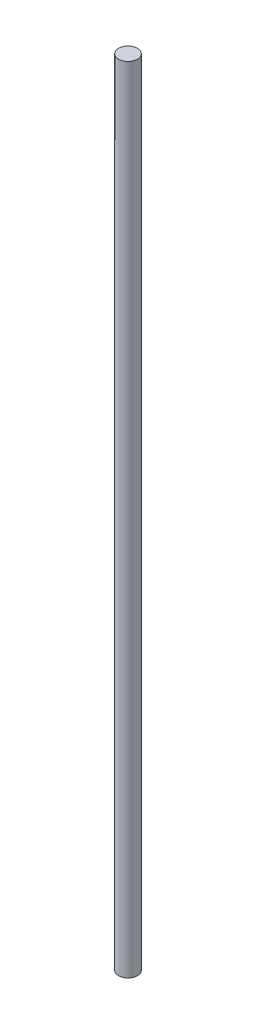
ISO-10303-21;
HEADER;
FILE_DESCRIPTION(('STEP AP214'),'2;1');
FILE_NAME('part.step','',(''),(''),'','','');
FILE_SCHEMA(('AUTOMOTIVE_DESIGN { 1 0 10303 214 1 1 1 1 }'));
ENDSEC;
DATA;
#1=APPLICATION_CONTEXT('core data for automotive mechanical design processes');
#2=APPLICATION_PROTOCOL_DEFINITION('international standard','automotive_design',2000,#1);
#3=PRODUCT_CONTEXT('',#1,'mechanical');
#4=PRODUCT('Part','Part','',(#3));
#5=PRODUCT_RELATED_PRODUCT_CATEGORY('part','',(#4));
#6=PRODUCT_DEFINITION_FORMATION('','',#4);
#7=PRODUCT_DEFINITION_CONTEXT('part definition',#1,'design');
#8=PRODUCT_DEFINITION('design','',#6,#7);
#9=PRODUCT_DEFINITION_SHAPE('','',#8);
#10=(LENGTH_UNIT() NAMED_UNIT(*) SI_UNIT(.MILLI.,.METRE.));
#11=(NAMED_UNIT(*) PLANE_ANGLE_UNIT() SI_UNIT($,.RADIAN.));
#12=(NAMED_UNIT(*) SI_UNIT($,.STERADIAN.) SOLID_ANGLE_UNIT());
#13=UNCERTAINTY_MEASURE_WITH_UNIT(LENGTH_MEASURE(1.E-05),#10,'distance_accuracy_value','');
#14=(GEOMETRIC_REPRESENTATION_CONTEXT(3) GLOBAL_UNCERTAINTY_ASSIGNED_CONTEXT((#13)) GLOBAL_UNIT_ASSIGNED_CONTEXT((#10,
#11,#12)) REPRESENTATION_CONTEXT('',''));
#15=CARTESIAN_POINT('',(0.,0.,0.));
#16=DIRECTION('',(0.,0.,1.));
#17=DIRECTION('',(1.,0.,0.));
#18=AXIS2_PLACEMENT_3D('',#15,#16,#17);
#19=CARTESIAN_POINT('',(0.,210.,0.));
#20=DIRECTION('',(0.,-1.,0.));
#21=DIRECTION('',(0.,0.,-1.));
#22=AXIS2_PLACEMENT_3D('',#19,#20,#21);
#23=CYLINDRICAL_SURFACE('',#22,2.5);
#24=CARTESIAN_POINT('',(0.,210.,0.));
#25=DIRECTION('',(0.,1.,0.));
#26=DIRECTION('',(0.,0.,1.));
#27=AXIS2_PLACEMENT_3D('',#24,#25,#26);
#28=CIRCLE('',#27,2.5);
#29=CARTESIAN_POINT('',(0.,210.,2.5));
#30=VERTEX_POINT('',#29);
#31=EDGE_CURVE('E10',#30,#30,#28,.T.);
#32=ORIENTED_EDGE('',*,*,#31,.F.);
#33=EDGE_LOOP('',(#32));
#34=FACE_BOUND('',#33,.T.);
#35=CARTESIAN_POINT('',(0.,0.,0.));
#36=DIRECTION('',(0.,1.,0.));
#37=DIRECTION('',(0.,0.,1.));
#38=AXIS2_PLACEMENT_3D('',#35,#36,#37);
#39=CIRCLE('',#38,2.5);
#40=CARTESIAN_POINT('',(0.,0.,2.5));
#41=VERTEX_POINT('',#40);
#42=EDGE_CURVE('E34',#41,#41,#39,.T.);
#43=ORIENTED_EDGE('',*,*,#42,.T.);
#44=EDGE_LOOP('',(#43));
#45=FACE_BOUND('',#44,.T.);
#46=ADVANCED_FACE('F31',(#34,#45),#23,.T.);
#47=CARTESIAN_POINT('',(0.,210.,0.));
#48=DIRECTION('',(0.,1.,0.));
#49=DIRECTION('',(0.,0.,1.));
#50=AXIS2_PLACEMENT_3D('',#47,#48,#49);
#51=PLANE('',#50);
#52=ORIENTED_EDGE('',*,*,#31,.T.);
#53=EDGE_LOOP('',(#52));
#54=FACE_BOUND('',#53,.T.);
#55=ADVANCED_FACE('F46',(#54),#51,.T.);
#56=CARTESIAN_POINT('',(0.,0.,0.));
#57=DIRECTION('',(0.,1.,0.));
#58=DIRECTION('',(0.,0.,1.));
#59=AXIS2_PLACEMENT_3D('',#56,#57,#58);
#60=PLANE('',#59);
#61=ORIENTED_EDGE('',*,*,#42,.F.);
#62=EDGE_LOOP('',(#61));
#63=FACE_BOUND('',#62,.T.);
#64=ADVANCED_FACE('F44',(#63),#60,.F.);
#65=CLOSED_SHELL('',(#46,#55,#64));
#66=MANIFOLD_SOLID_BREP('B2',#65);
#67=ADVANCED_BREP_SHAPE_REPRESENTATION('',(#18,#66),#14);
#68=SHAPE_DEFINITION_REPRESENTATION(#9,#67);
ENDSEC;
END-ISO-10303-21;
